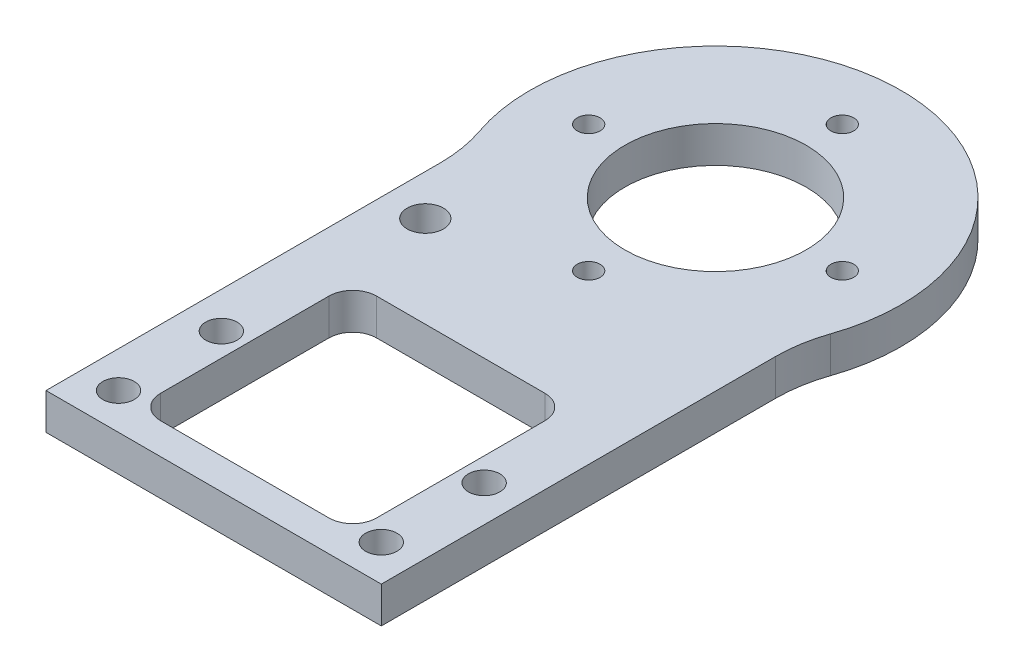
ISO-10303-21;
HEADER;
FILE_DESCRIPTION(('STEP AP214'),'2;1');
FILE_NAME('part.step','',(''),(''),'','','');
FILE_SCHEMA(('AUTOMOTIVE_DESIGN { 1 0 10303 214 1 1 1 1 }'));
ENDSEC;
DATA;
#1=APPLICATION_CONTEXT('core data for automotive mechanical design processes');
#2=APPLICATION_PROTOCOL_DEFINITION('international standard','automotive_design',2000,#1);
#3=PRODUCT_CONTEXT('',#1,'mechanical');
#4=PRODUCT('Part','Part','',(#3));
#5=PRODUCT_RELATED_PRODUCT_CATEGORY('part','',(#4));
#6=PRODUCT_DEFINITION_FORMATION('','',#4);
#7=PRODUCT_DEFINITION_CONTEXT('part definition',#1,'design');
#8=PRODUCT_DEFINITION('design','',#6,#7);
#9=PRODUCT_DEFINITION_SHAPE('','',#8);
#10=(LENGTH_UNIT() NAMED_UNIT(*) SI_UNIT(.MILLI.,.METRE.));
#11=(NAMED_UNIT(*) PLANE_ANGLE_UNIT() SI_UNIT($,.RADIAN.));
#12=(NAMED_UNIT(*) SI_UNIT($,.STERADIAN.) SOLID_ANGLE_UNIT());
#13=UNCERTAINTY_MEASURE_WITH_UNIT(LENGTH_MEASURE(1.E-05),#10,'distance_accuracy_value','');
#14=(GEOMETRIC_REPRESENTATION_CONTEXT(3) GLOBAL_UNCERTAINTY_ASSIGNED_CONTEXT((#13)) GLOBAL_UNIT_ASSIGNED_CONTEXT((#10,
#11,#12)) REPRESENTATION_CONTEXT('',''));
#15=CARTESIAN_POINT('',(0.,0.,0.));
#16=DIRECTION('',(0.,0.,1.));
#17=DIRECTION('',(1.,0.,0.));
#18=AXIS2_PLACEMENT_3D('',#15,#16,#17);
#19=CARTESIAN_POINT('',(54.7499999999753,193.281527043319,-116.366676691875));
#20=DIRECTION('',(0.,1.,0.));
#21=DIRECTION('',(0.,0.,1.));
#22=AXIS2_PLACEMENT_3D('',#19,#20,#21);
#23=PLANE('',#22);
#24=CARTESIAN_POINT('',(-22.225,193.281527043319,-106.629073008847));
#25=DIRECTION('',(0.,-1.,0.));
#26=DIRECTION('',(0.,0.,-1.));
#27=AXIS2_PLACEMENT_3D('',#24,#25,#26);
#28=CIRCLE('',#27,3.175);
#29=CARTESIAN_POINT('',(-22.225,193.281527043319,-109.804073008847));
#30=VERTEX_POINT('',#29);
#31=EDGE_CURVE('E384',#30,#30,#28,.T.);
#32=ORIENTED_EDGE('',*,*,#31,.F.);
#33=EDGE_LOOP('',(#32));
#34=FACE_BOUND('',#33,.T.);
#35=CARTESIAN_POINT('',(22.9999999999753,193.281527043319,-71.704073008941));
#36=DIRECTION('',(0.,-1.,0.));
#37=DIRECTION('',(0.,0.,-1.));
#38=AXIS2_PLACEMENT_3D('',#35,#36,#37);
#39=CIRCLE('',#38,2.75);
#40=CARTESIAN_POINT('',(22.9999999999753,193.281527043319,-74.454073008941));
#41=VERTEX_POINT('',#40);
#42=EDGE_CURVE('E202',#41,#41,#39,.T.);
#43=ORIENTED_EDGE('',*,*,#42,.F.);
#44=EDGE_LOOP('',(#43));
#45=FACE_BOUND('',#44,.T.);
#46=CARTESIAN_POINT('',(22.9999999999753,193.281527043319,-53.704073008941));
#47=DIRECTION('',(0.,-1.,0.));
#48=DIRECTION('',(0.,0.,-1.));
#49=AXIS2_PLACEMENT_3D('',#46,#47,#48);
#50=CIRCLE('',#49,2.75);
#51=CARTESIAN_POINT('',(22.9999999999753,193.281527043319,-56.454073008941));
#52=VERTEX_POINT('',#51);
#53=EDGE_CURVE('E208',#52,#52,#50,.T.);
#54=ORIENTED_EDGE('',*,*,#53,.F.);
#55=EDGE_LOOP('',(#54));
#56=FACE_BOUND('',#55,.T.);
#57=CARTESIAN_POINT('',(-23.0000000000247,193.281527043319,-53.704073008941));
#58=DIRECTION('',(0.,-1.,0.));
#59=DIRECTION('',(0.,0.,-1.));
#60=AXIS2_PLACEMENT_3D('',#57,#58,#59);
#61=CIRCLE('',#60,2.75);
#62=CARTESIAN_POINT('',(-23.0000000000247,193.281527043319,-56.454073008941));
#63=VERTEX_POINT('',#62);
#64=EDGE_CURVE('E214',#63,#63,#61,.T.);
#65=ORIENTED_EDGE('',*,*,#64,.F.);
#66=EDGE_LOOP('',(#65));
#67=FACE_BOUND('',#66,.T.);
#68=CARTESIAN_POINT('',(-23.0000000000247,193.281527043319,-71.704073008941));
#69=DIRECTION('',(0.,-1.,0.));
#70=DIRECTION('',(0.,0.,-1.));
#71=AXIS2_PLACEMENT_3D('',#68,#69,#70);
#72=CIRCLE('',#71,2.75);
#73=CARTESIAN_POINT('',(-23.0000000000247,193.281527043319,-74.454073008941));
#74=VERTEX_POINT('',#73);
#75=EDGE_CURVE('E220',#74,#74,#72,.T.);
#76=ORIENTED_EDGE('',*,*,#75,.F.);
#77=EDGE_LOOP('',(#76));
#78=FACE_BOUND('',#77,.T.);
#79=DIRECTION('',(0.,0.,1.));
#80=VECTOR('',#79,1.);
#81=CARTESIAN_POINT('',(29.3499999999753,193.281527043319,-47.354073008941));
#82=LINE('',#81,#80);
#83=CARTESIAN_POINT('',(29.3499999999753,193.281527043319,-116.366676691875));
#84=VERTEX_POINT('',#83);
#85=CARTESIAN_POINT('',(29.3499999999753,193.281527043319,-47.354073008941));
#86=VERTEX_POINT('',#85);
#87=EDGE_CURVE('E226',#84,#86,#82,.T.);
#88=ORIENTED_EDGE('',*,*,#87,.T.);
#89=DIRECTION('',(-1.,0.,0.));
#90=VECTOR('',#89,1.);
#91=CARTESIAN_POINT('',(-29.3499999999753,193.281527043319,-47.354073008941));
#92=LINE('',#91,#90);
#93=CARTESIAN_POINT('',(-29.3499999999753,193.281527043319,-47.354073008941));
#94=VERTEX_POINT('',#93);
#95=EDGE_CURVE('E229',#86,#94,#92,.T.);
#96=ORIENTED_EDGE('',*,*,#95,.T.);
#97=DIRECTION('',(0.,0.,-1.));
#98=VECTOR('',#97,1.);
#99=CARTESIAN_POINT('',(-29.3499999999753,193.281527043319,-47.354073008941));
#100=LINE('',#99,#98);
#101=CARTESIAN_POINT('',(-29.3499999999753,193.281527043319,-116.366676691875));
#102=VERTEX_POINT('',#101);
#103=EDGE_CURVE('E232',#94,#102,#100,.T.);
#104=ORIENTED_EDGE('',*,*,#103,.T.);
#105=CARTESIAN_POINT('',(-54.7499999999753,193.281527043319,-116.366676691875));
#106=DIRECTION('',(0.,1.,0.));
#107=DIRECTION('',(0.,0.,-1.));
#108=AXIS2_PLACEMENT_3D('',#105,#106,#107);
#109=CIRCLE('',#108,25.4);
#110=CARTESIAN_POINT('',(-30.7318652849602,193.281527043319,-124.630404955279));
#111=VERTEX_POINT('',#110);
#112=EDGE_CURVE('E234',#102,#111,#109,.T.);
#113=ORIENTED_EDGE('',*,*,#112,.T.);
#114=CARTESIAN_POINT('',(0.,193.281527043319,-135.204073008847));
#115=DIRECTION('',(0.,-1.,0.));
#116=DIRECTION('',(0.,0.,1.));
#117=AXIS2_PLACEMENT_3D('',#114,#115,#116);
#118=CIRCLE('',#117,32.5);
#119=CARTESIAN_POINT('',(30.7318652849603,193.281527043319,-124.630404955279));
#120=VERTEX_POINT('',#119);
#121=EDGE_CURVE('E236',#111,#120,#118,.T.);
#122=ORIENTED_EDGE('',*,*,#121,.T.);
#123=CARTESIAN_POINT('',(54.7499999999753,193.281527043319,-116.366676691875));
#124=DIRECTION('',(0.,1.,0.));
#125=DIRECTION('',(0.,0.,1.));
#126=AXIS2_PLACEMENT_3D('',#123,#124,#125);
#127=CIRCLE('',#126,25.4);
#128=EDGE_CURVE('E238',#120,#84,#127,.T.);
#129=ORIENTED_EDGE('',*,*,#128,.T.);
#130=EDGE_LOOP('',(#88,#96,#104,#113,#122,#129));
#131=FACE_BOUND('',#130,.T.);
#132=CARTESIAN_POINT('',(14.7394029729468,193.281527043319,-56.9646700380642));
#133=DIRECTION('',(0.,-1.,0.));
#134=DIRECTION('',(0.,0.,-1.));
#135=AXIS2_PLACEMENT_3D('',#132,#133,#134);
#136=CIRCLE('',#135,4.16559702660003);
#137=CARTESIAN_POINT('',(18.9049999995468,193.281527043319,-56.9646700359221));
#138=VERTEX_POINT('',#137);
#139=CARTESIAN_POINT('',(14.7394029728373,193.281527043319,-52.7990730114642));
#140=VERTEX_POINT('',#139);
#141=EDGE_CURVE('E134',#138,#140,#136,.T.);
#142=ORIENTED_EDGE('',*,*,#141,.F.);
#143=DIRECTION('',(0.,0.,1.));
#144=VECTOR('',#143,1.);
#145=CARTESIAN_POINT('',(18.9049999995468,193.281527043319,-56.9646700359221));
#146=LINE('',#145,#144);
#147=CARTESIAN_POINT('',(18.9049999995468,193.281527043319,-86.4434759817729));
#148=VERTEX_POINT('',#147);
#149=EDGE_CURVE('E169',#148,#138,#146,.T.);
#150=ORIENTED_EDGE('',*,*,#149,.F.);
#151=CARTESIAN_POINT('',(14.7394029729468,193.281527043319,-86.4434759796308));
#152=DIRECTION('',(0.,-1.,0.));
#153=DIRECTION('',(0.,0.,1.));
#154=AXIS2_PLACEMENT_3D('',#151,#152,#153);
#155=CIRCLE('',#154,4.16559702660003);
#156=CARTESIAN_POINT('',(14.7394029760849,193.281527043319,-90.6090730062308));
#157=VERTEX_POINT('',#156);
#158=EDGE_CURVE('E167',#157,#148,#155,.T.);
#159=ORIENTED_EDGE('',*,*,#158,.F.);
#160=DIRECTION('',(1.,0.,0.));
#161=VECTOR('',#160,1.);
#162=CARTESIAN_POINT('',(14.7394029760849,193.281527043319,-90.6090730062308));
#163=LINE('',#162,#161);
#164=CARTESIAN_POINT('',(-14.7394029729467,193.281527043319,-90.6090730062308));
#165=VERTEX_POINT('',#164);
#166=EDGE_CURVE('E165',#165,#157,#163,.T.);
#167=ORIENTED_EDGE('',*,*,#166,.F.);
#168=CARTESIAN_POINT('',(-14.7394029729468,193.281527043319,-86.4434759796308));
#169=DIRECTION('',(0.,-1.,0.));
#170=DIRECTION('',(0.,0.,-1.));
#171=AXIS2_PLACEMENT_3D('',#168,#169,#170);
#172=CIRCLE('',#171,4.16559702660003);
#173=CARTESIAN_POINT('',(-18.9049999995468,193.281527043319,-86.4434759817729));
#174=VERTEX_POINT('',#173);
#175=EDGE_CURVE('E163',#174,#165,#172,.T.);
#176=ORIENTED_EDGE('',*,*,#175,.F.);
#177=DIRECTION('',(0.,0.,-1.));
#178=VECTOR('',#177,1.);
#179=CARTESIAN_POINT('',(-18.9049999995468,193.281527043319,-56.9646700359221));
#180=LINE('',#179,#178);
#181=CARTESIAN_POINT('',(-18.9049999995468,193.281527043319,-56.9646700359221));
#182=VERTEX_POINT('',#181);
#183=EDGE_CURVE('E158',#182,#174,#180,.T.);
#184=ORIENTED_EDGE('',*,*,#183,.F.);
#185=CARTESIAN_POINT('',(-14.7394029729468,193.281527043319,-56.9646700380642));
#186=DIRECTION('',(0.,-1.,0.));
#187=DIRECTION('',(0.,0.,1.));
#188=AXIS2_PLACEMENT_3D('',#185,#186,#187);
#189=CIRCLE('',#188,4.16559702660003);
#190=CARTESIAN_POINT('',(-14.7394029730165,193.281527043319,-52.7990730114642));
#191=VERTEX_POINT('',#190);
#192=EDGE_CURVE('E156',#191,#182,#189,.T.);
#193=ORIENTED_EDGE('',*,*,#192,.F.);
#194=DIRECTION('',(-1.,0.,0.));
#195=VECTOR('',#194,1.);
#196=CARTESIAN_POINT('',(-14.7394029730165,193.281527043319,-52.7990730114642));
#197=LINE('',#196,#195);
#198=EDGE_CURVE('E142',#140,#191,#197,.T.);
#199=ORIENTED_EDGE('',*,*,#198,.F.);
#200=EDGE_LOOP('',(#142,#150,#159,#167,#176,#184,#193,#199));
#201=FACE_BOUND('',#200,.T.);
#202=CARTESIAN_POINT('',(0.,193.281527043319,-135.204073008847));
#203=DIRECTION('',(0.,-1.,0.));
#204=DIRECTION('',(0.,0.,-1.));
#205=AXIS2_PLACEMENT_3D('',#202,#203,#204);
#206=CIRCLE('',#205,15.875);
#207=CARTESIAN_POINT('',(0.,193.281527043319,-151.079073008847));
#208=VERTEX_POINT('',#207);
#209=EDGE_CURVE('E172',#208,#208,#206,.T.);
#210=ORIENTED_EDGE('',*,*,#209,.F.);
#211=EDGE_LOOP('',(#210));
#212=FACE_BOUND('',#211,.T.);
#213=CARTESIAN_POINT('',(-22.20000005,193.281527043319,-135.204073008847));
#214=DIRECTION('',(0.,-1.,0.));
#215=DIRECTION('',(0.,0.,-1.));
#216=AXIS2_PLACEMENT_3D('',#213,#214,#215);
#217=CIRCLE('',#216,2.00000000000001);
#218=CARTESIAN_POINT('',(-22.20000005,193.281527043319,-137.204073008848));
#219=VERTEX_POINT('',#218);
#220=EDGE_CURVE('E407',#219,#219,#217,.T.);
#221=ORIENTED_EDGE('',*,*,#220,.F.);
#222=EDGE_LOOP('',(#221));
#223=FACE_BOUND('',#222,.T.);
#224=CARTESIAN_POINT('',(0.,193.281527043319,-113.004072958847));
#225=DIRECTION('',(0.,-1.,0.));
#226=DIRECTION('',(0.,0.,-1.));
#227=AXIS2_PLACEMENT_3D('',#224,#225,#226);
#228=CIRCLE('',#227,2.00000000000001);
#229=CARTESIAN_POINT('',(0.,193.281527043319,-115.004072958847));
#230=VERTEX_POINT('',#229);
#231=EDGE_CURVE('E401',#230,#230,#228,.T.);
#232=ORIENTED_EDGE('',*,*,#231,.F.);
#233=EDGE_LOOP('',(#232));
#234=FACE_BOUND('',#233,.T.);
#235=CARTESIAN_POINT('',(22.20000005,193.281527043319,-135.204073008847));
#236=DIRECTION('',(0.,-1.,0.));
#237=DIRECTION('',(0.,0.,-1.));
#238=AXIS2_PLACEMENT_3D('',#235,#236,#237);
#239=CIRCLE('',#238,2.00000000000001);
#240=CARTESIAN_POINT('',(22.20000005,193.281527043319,-137.204073008848));
#241=VERTEX_POINT('',#240);
#242=EDGE_CURVE('E395',#241,#241,#239,.T.);
#243=ORIENTED_EDGE('',*,*,#242,.F.);
#244=EDGE_LOOP('',(#243));
#245=FACE_BOUND('',#244,.T.);
#246=CARTESIAN_POINT('',(0.,193.281527043319,-157.404073058848));
#247=DIRECTION('',(0.,-1.,0.));
#248=DIRECTION('',(0.,0.,-1.));
#249=AXIS2_PLACEMENT_3D('',#246,#247,#248);
#250=CIRCLE('',#249,2.);
#251=CARTESIAN_POINT('',(0.,193.281527043319,-159.404073058848));
#252=VERTEX_POINT('',#251);
#253=EDGE_CURVE('E389',#252,#252,#250,.T.);
#254=ORIENTED_EDGE('',*,*,#253,.F.);
#255=EDGE_LOOP('',(#254));
#256=FACE_BOUND('',#255,.T.);
#257=ADVANCED_FACE('F33',(#34,#45,#56,#67,#78,#131,#201,#212,#223,#234,#245,#256),#23,.F.);
#258=CARTESIAN_POINT('',(54.7499999999753,199.631527043319,-116.366676691875));
#259=DIRECTION('',(0.,1.,0.));
#260=DIRECTION('',(0.,0.,1.));
#261=AXIS2_PLACEMENT_3D('',#258,#259,#260);
#262=PLANE('',#261);
#263=CARTESIAN_POINT('',(-22.225,199.631527043319,-106.629073008847));
#264=DIRECTION('',(0.,-1.,0.));
#265=DIRECTION('',(0.,0.,-1.));
#266=AXIS2_PLACEMENT_3D('',#263,#264,#265);
#267=CIRCLE('',#266,3.175);
#268=CARTESIAN_POINT('',(-22.225,199.631527043319,-109.804073008847));
#269=VERTEX_POINT('',#268);
#270=EDGE_CURVE('E382',#269,#269,#267,.T.);
#271=ORIENTED_EDGE('',*,*,#270,.T.);
#272=EDGE_LOOP('',(#271));
#273=FACE_BOUND('',#272,.T.);
#274=CARTESIAN_POINT('',(22.20000005,199.631527043319,-135.204073008847));
#275=DIRECTION('',(0.,-1.,0.));
#276=DIRECTION('',(0.,0.,-1.));
#277=AXIS2_PLACEMENT_3D('',#274,#275,#276);
#278=CIRCLE('',#277,2.00000000000001);
#279=CARTESIAN_POINT('',(22.20000005,199.631527043319,-137.204073008848));
#280=VERTEX_POINT('',#279);
#281=EDGE_CURVE('E392',#280,#280,#278,.T.);
#282=ORIENTED_EDGE('',*,*,#281,.T.);
#283=EDGE_LOOP('',(#282));
#284=FACE_BOUND('',#283,.T.);
#285=CARTESIAN_POINT('',(-22.20000005,199.631527043319,-135.204073008847));
#286=DIRECTION('',(0.,-1.,0.));
#287=DIRECTION('',(0.,0.,-1.));
#288=AXIS2_PLACEMENT_3D('',#285,#286,#287);
#289=CIRCLE('',#288,2.00000000000001);
#290=CARTESIAN_POINT('',(-22.20000005,199.631527043319,-137.204073008848));
#291=VERTEX_POINT('',#290);
#292=EDGE_CURVE('E404',#291,#291,#289,.T.);
#293=ORIENTED_EDGE('',*,*,#292,.T.);
#294=EDGE_LOOP('',(#293));
#295=FACE_BOUND('',#294,.T.);
#296=DIRECTION('',(0.,0.,1.));
#297=VECTOR('',#296,1.);
#298=CARTESIAN_POINT('',(18.9049999995468,199.631527043319,-56.9646700359221));
#299=LINE('',#298,#297);
#300=CARTESIAN_POINT('',(18.9049999995468,199.631527043319,-86.4434759817729));
#301=VERTEX_POINT('',#300);
#302=CARTESIAN_POINT('',(18.9049999995468,199.631527043319,-56.9646700359221));
#303=VERTEX_POINT('',#302);
#304=EDGE_CURVE('E143',#301,#303,#299,.T.);
#305=ORIENTED_EDGE('',*,*,#304,.T.);
#306=CARTESIAN_POINT('',(14.7394029729468,199.631527043319,-56.9646700380642));
#307=DIRECTION('',(0.,-1.,0.));
#308=DIRECTION('',(0.,0.,-1.));
#309=AXIS2_PLACEMENT_3D('',#306,#307,#308);
#310=CIRCLE('',#309,4.16559702660003);
#311=CARTESIAN_POINT('',(14.7394029728373,199.631527043319,-52.7990730114642));
#312=VERTEX_POINT('',#311);
#313=EDGE_CURVE('E56',#303,#312,#310,.T.);
#314=ORIENTED_EDGE('',*,*,#313,.T.);
#315=DIRECTION('',(-1.,0.,0.));
#316=VECTOR('',#315,1.);
#317=CARTESIAN_POINT('',(-14.7394029730165,199.631527043319,-52.7990730114642));
#318=LINE('',#317,#316);
#319=CARTESIAN_POINT('',(-14.7394029730165,199.631527043319,-52.7990730114642));
#320=VERTEX_POINT('',#319);
#321=EDGE_CURVE('E149',#312,#320,#318,.T.);
#322=ORIENTED_EDGE('',*,*,#321,.T.);
#323=CARTESIAN_POINT('',(-14.7394029729468,199.631527043319,-56.9646700380642));
#324=DIRECTION('',(0.,-1.,0.));
#325=DIRECTION('',(0.,0.,1.));
#326=AXIS2_PLACEMENT_3D('',#323,#324,#325);
#327=CIRCLE('',#326,4.16559702660003);
#328=CARTESIAN_POINT('',(-18.9049999995468,199.631527043319,-56.9646700359221));
#329=VERTEX_POINT('',#328);
#330=EDGE_CURVE('E174',#320,#329,#327,.T.);
#331=ORIENTED_EDGE('',*,*,#330,.T.);
#332=DIRECTION('',(0.,0.,-1.));
#333=VECTOR('',#332,1.);
#334=CARTESIAN_POINT('',(-18.9049999995468,199.631527043319,-56.9646700359221));
#335=LINE('',#334,#333);
#336=CARTESIAN_POINT('',(-18.9049999995468,199.631527043319,-86.4434759817729));
#337=VERTEX_POINT('',#336);
#338=EDGE_CURVE('E177',#329,#337,#335,.T.);
#339=ORIENTED_EDGE('',*,*,#338,.T.);
#340=CARTESIAN_POINT('',(-14.7394029729468,199.631527043319,-86.4434759796308));
#341=DIRECTION('',(0.,-1.,0.));
#342=DIRECTION('',(0.,0.,-1.));
#343=AXIS2_PLACEMENT_3D('',#340,#341,#342);
#344=CIRCLE('',#343,4.16559702660003);
#345=CARTESIAN_POINT('',(-14.7394029729467,199.631527043319,-90.6090730062308));
#346=VERTEX_POINT('',#345);
#347=EDGE_CURVE('E180',#337,#346,#344,.T.);
#348=ORIENTED_EDGE('',*,*,#347,.T.);
#349=DIRECTION('',(1.,0.,0.));
#350=VECTOR('',#349,1.);
#351=CARTESIAN_POINT('',(14.7394029760849,199.631527043319,-90.6090730062308));
#352=LINE('',#351,#350);
#353=CARTESIAN_POINT('',(14.7394029760849,199.631527043319,-90.6090730062308));
#354=VERTEX_POINT('',#353);
#355=EDGE_CURVE('E183',#346,#354,#352,.T.);
#356=ORIENTED_EDGE('',*,*,#355,.T.);
#357=CARTESIAN_POINT('',(14.7394029729468,199.631527043319,-86.4434759796308));
#358=DIRECTION('',(0.,-1.,0.));
#359=DIRECTION('',(0.,0.,1.));
#360=AXIS2_PLACEMENT_3D('',#357,#358,#359);
#361=CIRCLE('',#360,4.16559702660003);
#362=EDGE_CURVE('E186',#354,#301,#361,.T.);
#363=ORIENTED_EDGE('',*,*,#362,.T.);
#364=EDGE_LOOP('',(#305,#314,#322,#331,#339,#348,#356,#363));
#365=FACE_BOUND('',#364,.T.);
#366=CARTESIAN_POINT('',(22.9999999999753,199.631527043319,-71.704073008941));
#367=DIRECTION('',(0.,-1.,0.));
#368=DIRECTION('',(0.,0.,-1.));
#369=AXIS2_PLACEMENT_3D('',#366,#367,#368);
#370=CIRCLE('',#369,2.75);
#371=CARTESIAN_POINT('',(22.9999999999753,199.631527043319,-74.454073008941));
#372=VERTEX_POINT('',#371);
#373=EDGE_CURVE('E150',#372,#372,#370,.T.);
#374=ORIENTED_EDGE('',*,*,#373,.T.);
#375=EDGE_LOOP('',(#374));
#376=FACE_BOUND('',#375,.T.);
#377=CARTESIAN_POINT('',(-23.0000000000247,199.631527043319,-53.704073008941));
#378=DIRECTION('',(0.,-1.,0.));
#379=DIRECTION('',(0.,0.,-1.));
#380=AXIS2_PLACEMENT_3D('',#377,#378,#379);
#381=CIRCLE('',#380,2.75);
#382=CARTESIAN_POINT('',(-23.0000000000247,199.631527043319,-56.454073008941));
#383=VERTEX_POINT('',#382);
#384=EDGE_CURVE('E211',#383,#383,#381,.T.);
#385=ORIENTED_EDGE('',*,*,#384,.T.);
#386=EDGE_LOOP('',(#385));
#387=FACE_BOUND('',#386,.T.);
#388=DIRECTION('',(0.,0.,1.));
#389=VECTOR('',#388,1.);
#390=CARTESIAN_POINT('',(29.3499999999753,199.631527043319,-47.354073008941));
#391=LINE('',#390,#389);
#392=CARTESIAN_POINT('',(29.3499999999753,199.631527043319,-116.366676691875));
#393=VERTEX_POINT('',#392);
#394=CARTESIAN_POINT('',(29.3499999999753,199.631527043319,-47.354073008941));
#395=VERTEX_POINT('',#394);
#396=EDGE_CURVE('E223',#393,#395,#391,.T.);
#397=ORIENTED_EDGE('',*,*,#396,.F.);
#398=CARTESIAN_POINT('',(54.7499999999753,199.631527043319,-116.366676691875));
#399=DIRECTION('',(0.,1.,0.));
#400=DIRECTION('',(0.,0.,1.));
#401=AXIS2_PLACEMENT_3D('',#398,#399,#400);
#402=CIRCLE('',#401,25.4);
#403=CARTESIAN_POINT('',(30.7318652849603,199.631527043319,-124.630404955279));
#404=VERTEX_POINT('',#403);
#405=EDGE_CURVE('E230',#404,#393,#402,.T.);
#406=ORIENTED_EDGE('',*,*,#405,.F.);
#407=CARTESIAN_POINT('',(0.,199.631527043319,-135.204073008847));
#408=DIRECTION('',(0.,-1.,0.));
#409=DIRECTION('',(0.,0.,1.));
#410=AXIS2_PLACEMENT_3D('',#407,#408,#409);
#411=CIRCLE('',#410,32.5);
#412=CARTESIAN_POINT('',(-30.7318652849602,199.631527043319,-124.630404955279));
#413=VERTEX_POINT('',#412);
#414=EDGE_CURVE('E249',#413,#404,#411,.T.);
#415=ORIENTED_EDGE('',*,*,#414,.F.);
#416=CARTESIAN_POINT('',(-54.7499999999753,199.631527043319,-116.366676691875));
#417=DIRECTION('',(0.,1.,0.));
#418=DIRECTION('',(0.,0.,-1.));
#419=AXIS2_PLACEMENT_3D('',#416,#417,#418);
#420=CIRCLE('',#419,25.4);
#421=CARTESIAN_POINT('',(-29.3499999999753,199.631527043319,-116.366676691875));
#422=VERTEX_POINT('',#421);
#423=EDGE_CURVE('E247',#422,#413,#420,.T.);
#424=ORIENTED_EDGE('',*,*,#423,.F.);
#425=DIRECTION('',(0.,0.,-1.));
#426=VECTOR('',#425,1.);
#427=CARTESIAN_POINT('',(-29.3499999999753,199.631527043319,-47.354073008941));
#428=LINE('',#427,#426);
#429=CARTESIAN_POINT('',(-29.3499999999753,199.631527043319,-47.354073008941));
#430=VERTEX_POINT('',#429);
#431=EDGE_CURVE('E245',#430,#422,#428,.T.);
#432=ORIENTED_EDGE('',*,*,#431,.F.);
#433=DIRECTION('',(-1.,0.,0.));
#434=VECTOR('',#433,1.);
#435=CARTESIAN_POINT('',(-29.3499999999753,199.631527043319,-47.354073008941));
#436=LINE('',#435,#434);
#437=EDGE_CURVE('E243',#395,#430,#436,.T.);
#438=ORIENTED_EDGE('',*,*,#437,.F.);
#439=EDGE_LOOP('',(#397,#406,#415,#424,#432,#438));
#440=FACE_BOUND('',#439,.T.);
#441=CARTESIAN_POINT('',(-23.0000000000247,199.631527043319,-71.704073008941));
#442=DIRECTION('',(0.,-1.,0.));
#443=DIRECTION('',(0.,0.,-1.));
#444=AXIS2_PLACEMENT_3D('',#441,#442,#443);
#445=CIRCLE('',#444,2.75);
#446=CARTESIAN_POINT('',(-23.0000000000247,199.631527043319,-74.454073008941));
#447=VERTEX_POINT('',#446);
#448=EDGE_CURVE('E217',#447,#447,#445,.T.);
#449=ORIENTED_EDGE('',*,*,#448,.T.);
#450=EDGE_LOOP('',(#449));
#451=FACE_BOUND('',#450,.T.);
#452=CARTESIAN_POINT('',(22.9999999999753,199.631527043319,-53.704073008941));
#453=DIRECTION('',(0.,-1.,0.));
#454=DIRECTION('',(0.,0.,-1.));
#455=AXIS2_PLACEMENT_3D('',#452,#453,#454);
#456=CIRCLE('',#455,2.75);
#457=CARTESIAN_POINT('',(22.9999999999753,199.631527043319,-56.454073008941));
#458=VERTEX_POINT('',#457);
#459=EDGE_CURVE('E205',#458,#458,#456,.T.);
#460=ORIENTED_EDGE('',*,*,#459,.T.);
#461=EDGE_LOOP('',(#460));
#462=FACE_BOUND('',#461,.T.);
#463=CARTESIAN_POINT('',(0.,199.631527043319,-135.204073008847));
#464=DIRECTION('',(0.,-1.,0.));
#465=DIRECTION('',(0.,0.,-1.));
#466=AXIS2_PLACEMENT_3D('',#463,#464,#465);
#467=CIRCLE('',#466,15.875);
#468=CARTESIAN_POINT('',(0.,199.631527043319,-151.079073008847));
#469=VERTEX_POINT('',#468);
#470=EDGE_CURVE('E410',#469,#469,#467,.T.);
#471=ORIENTED_EDGE('',*,*,#470,.T.);
#472=EDGE_LOOP('',(#471));
#473=FACE_BOUND('',#472,.T.);
#474=CARTESIAN_POINT('',(0.,199.631527043319,-113.004072958847));
#475=DIRECTION('',(0.,-1.,0.));
#476=DIRECTION('',(0.,0.,-1.));
#477=AXIS2_PLACEMENT_3D('',#474,#475,#476);
#478=CIRCLE('',#477,2.00000000000001);
#479=CARTESIAN_POINT('',(0.,199.631527043319,-115.004072958847));
#480=VERTEX_POINT('',#479);
#481=EDGE_CURVE('E398',#480,#480,#478,.T.);
#482=ORIENTED_EDGE('',*,*,#481,.T.);
#483=EDGE_LOOP('',(#482));
#484=FACE_BOUND('',#483,.T.);
#485=CARTESIAN_POINT('',(0.,199.631527043319,-157.404073058848));
#486=DIRECTION('',(0.,-1.,0.));
#487=DIRECTION('',(0.,0.,-1.));
#488=AXIS2_PLACEMENT_3D('',#485,#486,#487);
#489=CIRCLE('',#488,2.);
#490=CARTESIAN_POINT('',(0.,199.631527043319,-159.404073058848));
#491=VERTEX_POINT('',#490);
#492=EDGE_CURVE('E386',#491,#491,#489,.T.);
#493=ORIENTED_EDGE('',*,*,#492,.T.);
#494=EDGE_LOOP('',(#493));
#495=FACE_BOUND('',#494,.T.);
#496=ADVANCED_FACE('F273',(#273,#284,#295,#365,#376,#387,#440,#451,#462,#473,#484,#495),#262,.T.);
#497=CARTESIAN_POINT('',(29.3499999999753,193.281527043319,-47.354073008941));
#498=DIRECTION('',(-1.,0.,0.));
#499=DIRECTION('',(0.,0.,1.));
#500=AXIS2_PLACEMENT_3D('',#497,#498,#499);
#501=PLANE('',#500);
#502=ORIENTED_EDGE('',*,*,#396,.T.);
#503=DIRECTION('',(0.,1.,0.));
#504=VECTOR('',#503,1.);
#505=CARTESIAN_POINT('',(29.3499999999753,193.281527043319,-47.354073008941));
#506=LINE('',#505,#504);
#507=EDGE_CURVE('E11',#86,#395,#506,.T.);
#508=ORIENTED_EDGE('',*,*,#507,.F.);
#509=ORIENTED_EDGE('',*,*,#87,.F.);
#510=DIRECTION('',(0.,1.,0.));
#511=VECTOR('',#510,1.);
#512=CARTESIAN_POINT('',(29.3499999999753,193.281527043319,-116.366676691875));
#513=LINE('',#512,#511);
#514=EDGE_CURVE('E240',#84,#393,#513,.T.);
#515=ORIENTED_EDGE('',*,*,#514,.T.);
#516=EDGE_LOOP('',(#502,#508,#509,#515));
#517=FACE_BOUND('',#516,.T.);
#518=ADVANCED_FACE('F35',(#517),#501,.F.);
#519=CARTESIAN_POINT('',(-29.3499999999753,193.281527043319,-47.354073008941));
#520=DIRECTION('',(0.,0.,-1.));
#521=DIRECTION('',(0.,1.,0.));
#522=AXIS2_PLACEMENT_3D('',#519,#520,#521);
#523=PLANE('',#522);
#524=ORIENTED_EDGE('',*,*,#437,.T.);
#525=DIRECTION('',(0.,1.,0.));
#526=VECTOR('',#525,1.);
#527=CARTESIAN_POINT('',(-29.3499999999753,193.281527043319,-47.354073008941));
#528=LINE('',#527,#526);
#529=EDGE_CURVE('E41',#94,#430,#528,.T.);
#530=ORIENTED_EDGE('',*,*,#529,.F.);
#531=ORIENTED_EDGE('',*,*,#95,.F.);
#532=ORIENTED_EDGE('',*,*,#507,.T.);
#533=EDGE_LOOP('',(#524,#530,#531,#532));
#534=FACE_BOUND('',#533,.T.);
#535=ADVANCED_FACE('F290',(#534),#523,.F.);
#536=CARTESIAN_POINT('',(-29.3499999999753,193.281527043319,-47.354073008941));
#537=DIRECTION('',(1.,0.,0.));
#538=DIRECTION('',(0.,0.,-1.));
#539=AXIS2_PLACEMENT_3D('',#536,#537,#538);
#540=PLANE('',#539);
#541=ORIENTED_EDGE('',*,*,#431,.T.);
#542=DIRECTION('',(0.,1.,0.));
#543=VECTOR('',#542,1.);
#544=CARTESIAN_POINT('',(-29.3499999999753,193.281527043319,-116.366676691875));
#545=LINE('',#544,#543);
#546=EDGE_CURVE('E260',#102,#422,#545,.T.);
#547=ORIENTED_EDGE('',*,*,#546,.F.);
#548=ORIENTED_EDGE('',*,*,#103,.F.);
#549=ORIENTED_EDGE('',*,*,#529,.T.);
#550=EDGE_LOOP('',(#541,#547,#548,#549));
#551=FACE_BOUND('',#550,.T.);
#552=ADVANCED_FACE('F267',(#551),#540,.F.);
#553=CARTESIAN_POINT('',(-54.7499999999753,193.281527043319,-116.366676691875));
#554=DIRECTION('',(0.,1.,0.));
#555=DIRECTION('',(0.,0.,1.));
#556=AXIS2_PLACEMENT_3D('',#553,#554,#555);
#557=CYLINDRICAL_SURFACE('',#556,25.4);
#558=ORIENTED_EDGE('',*,*,#423,.T.);
#559=DIRECTION('',(0.,1.,0.));
#560=VECTOR('',#559,1.);
#561=CARTESIAN_POINT('',(-30.7318652849602,193.281527043319,-124.630404955279));
#562=LINE('',#561,#560);
#563=EDGE_CURVE('E257',#111,#413,#562,.T.);
#564=ORIENTED_EDGE('',*,*,#563,.F.);
#565=ORIENTED_EDGE('',*,*,#112,.F.);
#566=ORIENTED_EDGE('',*,*,#546,.T.);
#567=EDGE_LOOP('',(#558,#564,#565,#566));
#568=FACE_BOUND('',#567,.T.);
#569=ADVANCED_FACE('F279',(#568),#557,.F.);
#570=CARTESIAN_POINT('',(0.,193.281527043319,-135.204073008847));
#571=DIRECTION('',(0.,1.,0.));
#572=DIRECTION('',(0.,0.,1.));
#573=AXIS2_PLACEMENT_3D('',#570,#571,#572);
#574=CYLINDRICAL_SURFACE('',#573,32.5);
#575=ORIENTED_EDGE('',*,*,#414,.T.);
#576=DIRECTION('',(0.,1.,0.));
#577=VECTOR('',#576,1.);
#578=CARTESIAN_POINT('',(30.7318652849603,193.281527043319,-124.630404955279));
#579=LINE('',#578,#577);
#580=EDGE_CURVE('E254',#120,#404,#579,.T.);
#581=ORIENTED_EDGE('',*,*,#580,.F.);
#582=ORIENTED_EDGE('',*,*,#121,.F.);
#583=ORIENTED_EDGE('',*,*,#563,.T.);
#584=EDGE_LOOP('',(#575,#581,#582,#583));
#585=FACE_BOUND('',#584,.T.);
#586=ADVANCED_FACE('F283',(#585),#574,.T.);
#587=CARTESIAN_POINT('',(54.7499999999753,193.281527043319,-116.366676691875));
#588=DIRECTION('',(0.,1.,0.));
#589=DIRECTION('',(0.,0.,1.));
#590=AXIS2_PLACEMENT_3D('',#587,#588,#589);
#591=CYLINDRICAL_SURFACE('',#590,25.4);
#592=ORIENTED_EDGE('',*,*,#405,.T.);
#593=ORIENTED_EDGE('',*,*,#514,.F.);
#594=ORIENTED_EDGE('',*,*,#128,.F.);
#595=ORIENTED_EDGE('',*,*,#580,.T.);
#596=EDGE_LOOP('',(#592,#593,#594,#595));
#597=FACE_BOUND('',#596,.T.);
#598=ADVANCED_FACE('F293',(#597),#591,.F.);
#599=CARTESIAN_POINT('',(-23.0000000000247,193.281527043319,-71.704073008941));
#600=DIRECTION('',(0.,1.,0.));
#601=DIRECTION('',(0.,0.,1.));
#602=AXIS2_PLACEMENT_3D('',#599,#600,#601);
#603=CYLINDRICAL_SURFACE('',#602,2.75);
#604=ORIENTED_EDGE('',*,*,#75,.T.);
#605=EDGE_LOOP('',(#604));
#606=FACE_BOUND('',#605,.T.);
#607=ORIENTED_EDGE('',*,*,#448,.F.);
#608=EDGE_LOOP('',(#607));
#609=FACE_BOUND('',#608,.T.);
#610=ADVANCED_FACE('F295',(#606,#609),#603,.F.);
#611=CARTESIAN_POINT('',(-23.0000000000247,193.281527043319,-53.704073008941));
#612=DIRECTION('',(0.,1.,0.));
#613=DIRECTION('',(0.,0.,1.));
#614=AXIS2_PLACEMENT_3D('',#611,#612,#613);
#615=CYLINDRICAL_SURFACE('',#614,2.75);
#616=ORIENTED_EDGE('',*,*,#64,.T.);
#617=EDGE_LOOP('',(#616));
#618=FACE_BOUND('',#617,.T.);
#619=ORIENTED_EDGE('',*,*,#384,.F.);
#620=EDGE_LOOP('',(#619));
#621=FACE_BOUND('',#620,.T.);
#622=ADVANCED_FACE('F301',(#618,#621),#615,.F.);
#623=CARTESIAN_POINT('',(22.9999999999753,193.281527043319,-53.704073008941));
#624=DIRECTION('',(0.,1.,0.));
#625=DIRECTION('',(0.,0.,1.));
#626=AXIS2_PLACEMENT_3D('',#623,#624,#625);
#627=CYLINDRICAL_SURFACE('',#626,2.75);
#628=ORIENTED_EDGE('',*,*,#53,.T.);
#629=EDGE_LOOP('',(#628));
#630=FACE_BOUND('',#629,.T.);
#631=ORIENTED_EDGE('',*,*,#459,.F.);
#632=EDGE_LOOP('',(#631));
#633=FACE_BOUND('',#632,.T.);
#634=ADVANCED_FACE('F318',(#630,#633),#627,.F.);
#635=CARTESIAN_POINT('',(22.9999999999753,193.281527043319,-71.704073008941));
#636=DIRECTION('',(0.,1.,0.));
#637=DIRECTION('',(0.,0.,1.));
#638=AXIS2_PLACEMENT_3D('',#635,#636,#637);
#639=CYLINDRICAL_SURFACE('',#638,2.75);
#640=ORIENTED_EDGE('',*,*,#42,.T.);
#641=EDGE_LOOP('',(#640));
#642=FACE_BOUND('',#641,.T.);
#643=ORIENTED_EDGE('',*,*,#373,.F.);
#644=EDGE_LOOP('',(#643));
#645=FACE_BOUND('',#644,.T.);
#646=ADVANCED_FACE('F322',(#642,#645),#639,.F.);
#647=CARTESIAN_POINT('',(14.7394029729468,193.281527043319,-56.9646700380642));
#648=DIRECTION('',(0.,1.,0.));
#649=DIRECTION('',(0.,0.,1.));
#650=AXIS2_PLACEMENT_3D('',#647,#648,#649);
#651=CYLINDRICAL_SURFACE('',#650,4.16559702660003);
#652=ORIENTED_EDGE('',*,*,#313,.F.);
#653=DIRECTION('',(0.,1.,0.));
#654=VECTOR('',#653,1.);
#655=CARTESIAN_POINT('',(18.9049999995468,193.281527043319,-56.9646700359221));
#656=LINE('',#655,#654);
#657=EDGE_CURVE('E138',#138,#303,#656,.T.);
#658=ORIENTED_EDGE('',*,*,#657,.F.);
#659=ORIENTED_EDGE('',*,*,#141,.T.);
#660=DIRECTION('',(0.,1.,0.));
#661=VECTOR('',#660,1.);
#662=CARTESIAN_POINT('',(14.7394029728373,193.281527043319,-52.7990730114642));
#663=LINE('',#662,#661);
#664=EDGE_CURVE('E137',#140,#312,#663,.T.);
#665=ORIENTED_EDGE('',*,*,#664,.T.);
#666=EDGE_LOOP('',(#652,#658,#659,#665));
#667=FACE_BOUND('',#666,.T.);
#668=ADVANCED_FACE('F136',(#667),#651,.F.);
#669=CARTESIAN_POINT('',(-14.7394029730165,193.281527043319,-52.7990730114642));
#670=DIRECTION('',(0.,0.,-1.));
#671=DIRECTION('',(-1.,0.,0.));
#672=AXIS2_PLACEMENT_3D('',#669,#670,#671);
#673=PLANE('',#672);
#674=ORIENTED_EDGE('',*,*,#321,.F.);
#675=ORIENTED_EDGE('',*,*,#664,.F.);
#676=ORIENTED_EDGE('',*,*,#198,.T.);
#677=DIRECTION('',(0.,1.,0.));
#678=VECTOR('',#677,1.);
#679=CARTESIAN_POINT('',(-14.7394029730165,193.281527043319,-52.7990730114642));
#680=LINE('',#679,#678);
#681=EDGE_CURVE('E151',#191,#320,#680,.T.);
#682=ORIENTED_EDGE('',*,*,#681,.T.);
#683=EDGE_LOOP('',(#674,#675,#676,#682));
#684=FACE_BOUND('',#683,.T.);
#685=ADVANCED_FACE('F146',(#684),#673,.T.);
#686=CARTESIAN_POINT('',(-14.7394029729468,193.281527043319,-56.9646700380642));
#687=DIRECTION('',(0.,1.,0.));
#688=DIRECTION('',(0.,0.,1.));
#689=AXIS2_PLACEMENT_3D('',#686,#687,#688);
#690=CYLINDRICAL_SURFACE('',#689,4.16559702660003);
#691=ORIENTED_EDGE('',*,*,#330,.F.);
#692=ORIENTED_EDGE('',*,*,#681,.F.);
#693=ORIENTED_EDGE('',*,*,#192,.T.);
#694=DIRECTION('',(0.,1.,0.));
#695=VECTOR('',#694,1.);
#696=CARTESIAN_POINT('',(-18.9049999995468,193.281527043319,-56.9646700359221));
#697=LINE('',#696,#695);
#698=EDGE_CURVE('E199',#182,#329,#697,.T.);
#699=ORIENTED_EDGE('',*,*,#698,.T.);
#700=EDGE_LOOP('',(#691,#692,#693,#699));
#701=FACE_BOUND('',#700,.T.);
#702=ADVANCED_FACE('F331',(#701),#690,.F.);
#703=CARTESIAN_POINT('',(-18.9049999995468,193.281527043319,-56.9646700359221));
#704=DIRECTION('',(1.,0.,0.));
#705=DIRECTION('',(0.,0.,-1.));
#706=AXIS2_PLACEMENT_3D('',#703,#704,#705);
#707=PLANE('',#706);
#708=ORIENTED_EDGE('',*,*,#338,.F.);
#709=ORIENTED_EDGE('',*,*,#698,.F.);
#710=ORIENTED_EDGE('',*,*,#183,.T.);
#711=DIRECTION('',(0.,1.,0.));
#712=VECTOR('',#711,1.);
#713=CARTESIAN_POINT('',(-18.9049999995468,193.281527043319,-86.4434759817729));
#714=LINE('',#713,#712);
#715=EDGE_CURVE('E197',#174,#337,#714,.T.);
#716=ORIENTED_EDGE('',*,*,#715,.T.);
#717=EDGE_LOOP('',(#708,#709,#710,#716));
#718=FACE_BOUND('',#717,.T.);
#719=ADVANCED_FACE('F334',(#718),#707,.T.);
#720=CARTESIAN_POINT('',(-14.7394029729468,193.281527043319,-86.4434759796308));
#721=DIRECTION('',(0.,1.,0.));
#722=DIRECTION('',(0.,0.,1.));
#723=AXIS2_PLACEMENT_3D('',#720,#721,#722);
#724=CYLINDRICAL_SURFACE('',#723,4.16559702660003);
#725=ORIENTED_EDGE('',*,*,#347,.F.);
#726=ORIENTED_EDGE('',*,*,#715,.F.);
#727=ORIENTED_EDGE('',*,*,#175,.T.);
#728=DIRECTION('',(0.,1.,0.));
#729=VECTOR('',#728,1.);
#730=CARTESIAN_POINT('',(-14.7394029729467,193.281527043319,-90.6090730062308));
#731=LINE('',#730,#729);
#732=EDGE_CURVE('E195',#165,#346,#731,.T.);
#733=ORIENTED_EDGE('',*,*,#732,.T.);
#734=EDGE_LOOP('',(#725,#726,#727,#733));
#735=FACE_BOUND('',#734,.T.);
#736=ADVANCED_FACE('F338',(#735),#724,.F.);
#737=CARTESIAN_POINT('',(14.7394029760849,193.281527043319,-90.6090730062308));
#738=DIRECTION('',(0.,0.,1.));
#739=DIRECTION('',(0.,-1.,0.));
#740=AXIS2_PLACEMENT_3D('',#737,#738,#739);
#741=PLANE('',#740);
#742=ORIENTED_EDGE('',*,*,#355,.F.);
#743=ORIENTED_EDGE('',*,*,#732,.F.);
#744=ORIENTED_EDGE('',*,*,#166,.T.);
#745=DIRECTION('',(0.,1.,0.));
#746=VECTOR('',#745,1.);
#747=CARTESIAN_POINT('',(14.7394029760849,193.281527043319,-90.6090730062308));
#748=LINE('',#747,#746);
#749=EDGE_CURVE('E193',#157,#354,#748,.T.);
#750=ORIENTED_EDGE('',*,*,#749,.T.);
#751=EDGE_LOOP('',(#742,#743,#744,#750));
#752=FACE_BOUND('',#751,.T.);
#753=ADVANCED_FACE('F342',(#752),#741,.T.);
#754=CARTESIAN_POINT('',(14.7394029729468,193.281527043319,-86.4434759796308));
#755=DIRECTION('',(0.,1.,0.));
#756=DIRECTION('',(0.,0.,1.));
#757=AXIS2_PLACEMENT_3D('',#754,#755,#756);
#758=CYLINDRICAL_SURFACE('',#757,4.16559702660003);
#759=ORIENTED_EDGE('',*,*,#362,.F.);
#760=ORIENTED_EDGE('',*,*,#749,.F.);
#761=ORIENTED_EDGE('',*,*,#158,.T.);
#762=DIRECTION('',(0.,1.,0.));
#763=VECTOR('',#762,1.);
#764=CARTESIAN_POINT('',(18.9049999995468,193.281527043319,-86.4434759817729));
#765=LINE('',#764,#763);
#766=EDGE_CURVE('E48',#148,#301,#765,.T.);
#767=ORIENTED_EDGE('',*,*,#766,.T.);
#768=EDGE_LOOP('',(#759,#760,#761,#767));
#769=FACE_BOUND('',#768,.T.);
#770=ADVANCED_FACE('F346',(#769),#758,.F.);
#771=CARTESIAN_POINT('',(18.9049999995468,193.281527043319,-56.9646700359221));
#772=DIRECTION('',(-1.,0.,0.));
#773=DIRECTION('',(0.,0.,1.));
#774=AXIS2_PLACEMENT_3D('',#771,#772,#773);
#775=PLANE('',#774);
#776=ORIENTED_EDGE('',*,*,#304,.F.);
#777=ORIENTED_EDGE('',*,*,#766,.F.);
#778=ORIENTED_EDGE('',*,*,#149,.T.);
#779=ORIENTED_EDGE('',*,*,#657,.T.);
#780=EDGE_LOOP('',(#776,#777,#778,#779));
#781=FACE_BOUND('',#780,.T.);
#782=ADVANCED_FACE('F350',(#781),#775,.T.);
#783=CARTESIAN_POINT('',(0.,193.281527043319,-135.204073008847));
#784=DIRECTION('',(0.,1.,0.));
#785=DIRECTION('',(0.,0.,1.));
#786=AXIS2_PLACEMENT_3D('',#783,#784,#785);
#787=CYLINDRICAL_SURFACE('',#786,15.875);
#788=ORIENTED_EDGE('',*,*,#209,.T.);
#789=EDGE_LOOP('',(#788));
#790=FACE_BOUND('',#789,.T.);
#791=ORIENTED_EDGE('',*,*,#470,.F.);
#792=EDGE_LOOP('',(#791));
#793=FACE_BOUND('',#792,.T.);
#794=ADVANCED_FACE('F354',(#790,#793),#787,.F.);
#795=CARTESIAN_POINT('',(-22.20000005,193.281527043319,-135.204073008847));
#796=DIRECTION('',(0.,1.,0.));
#797=DIRECTION('',(0.,0.,1.));
#798=AXIS2_PLACEMENT_3D('',#795,#796,#797);
#799=CYLINDRICAL_SURFACE('',#798,2.00000000000001);
#800=ORIENTED_EDGE('',*,*,#220,.T.);
#801=EDGE_LOOP('',(#800));
#802=FACE_BOUND('',#801,.T.);
#803=ORIENTED_EDGE('',*,*,#292,.F.);
#804=EDGE_LOOP('',(#803));
#805=FACE_BOUND('',#804,.T.);
#806=ADVANCED_FACE('F357',(#802,#805),#799,.F.);
#807=CARTESIAN_POINT('',(0.,193.281527043319,-113.004072958847));
#808=DIRECTION('',(0.,1.,0.));
#809=DIRECTION('',(0.,0.,1.));
#810=AXIS2_PLACEMENT_3D('',#807,#808,#809);
#811=CYLINDRICAL_SURFACE('',#810,2.00000000000001);
#812=ORIENTED_EDGE('',*,*,#231,.T.);
#813=EDGE_LOOP('',(#812));
#814=FACE_BOUND('',#813,.T.);
#815=ORIENTED_EDGE('',*,*,#481,.F.);
#816=EDGE_LOOP('',(#815));
#817=FACE_BOUND('',#816,.T.);
#818=ADVANCED_FACE('F361',(#814,#817),#811,.F.);
#819=CARTESIAN_POINT('',(22.20000005,193.281527043319,-135.204073008847));
#820=DIRECTION('',(0.,1.,0.));
#821=DIRECTION('',(0.,0.,1.));
#822=AXIS2_PLACEMENT_3D('',#819,#820,#821);
#823=CYLINDRICAL_SURFACE('',#822,2.00000000000001);
#824=ORIENTED_EDGE('',*,*,#242,.T.);
#825=EDGE_LOOP('',(#824));
#826=FACE_BOUND('',#825,.T.);
#827=ORIENTED_EDGE('',*,*,#281,.F.);
#828=EDGE_LOOP('',(#827));
#829=FACE_BOUND('',#828,.T.);
#830=ADVANCED_FACE('F365',(#826,#829),#823,.F.);
#831=CARTESIAN_POINT('',(0.,193.281527043319,-157.404073058848));
#832=DIRECTION('',(0.,1.,0.));
#833=DIRECTION('',(0.,0.,1.));
#834=AXIS2_PLACEMENT_3D('',#831,#832,#833);
#835=CYLINDRICAL_SURFACE('',#834,2.);
#836=ORIENTED_EDGE('',*,*,#253,.T.);
#837=EDGE_LOOP('',(#836));
#838=FACE_BOUND('',#837,.T.);
#839=ORIENTED_EDGE('',*,*,#492,.F.);
#840=EDGE_LOOP('',(#839));
#841=FACE_BOUND('',#840,.T.);
#842=ADVANCED_FACE('F369',(#838,#841),#835,.F.);
#843=CARTESIAN_POINT('',(-22.225,199.631527043319,-106.629073008847));
#844=DIRECTION('',(0.,-1.,0.));
#845=DIRECTION('',(0.,0.,-1.));
#846=AXIS2_PLACEMENT_3D('',#843,#844,#845);
#847=CYLINDRICAL_SURFACE('',#846,3.175);
#848=ORIENTED_EDGE('',*,*,#270,.F.);
#849=EDGE_LOOP('',(#848));
#850=FACE_BOUND('',#849,.T.);
#851=ORIENTED_EDGE('',*,*,#31,.T.);
#852=EDGE_LOOP('',(#851));
#853=FACE_BOUND('',#852,.T.);
#854=ADVANCED_FACE('F373',(#850,#853),#847,.F.);
#855=CLOSED_SHELL('',(#257,#496,#518,#535,#552,#569,#586,#598,#610,#622,#634,#646,#668,#685,
#702,#719,#736,#753,#770,#782,#794,#806,#818,#830,#842,#854));
#856=MANIFOLD_SOLID_BREP('B2',#855);
#857=ADVANCED_BREP_SHAPE_REPRESENTATION('',(#18,#856),#14);
#858=SHAPE_DEFINITION_REPRESENTATION(#9,#857);
ENDSEC;
END-ISO-10303-21;
